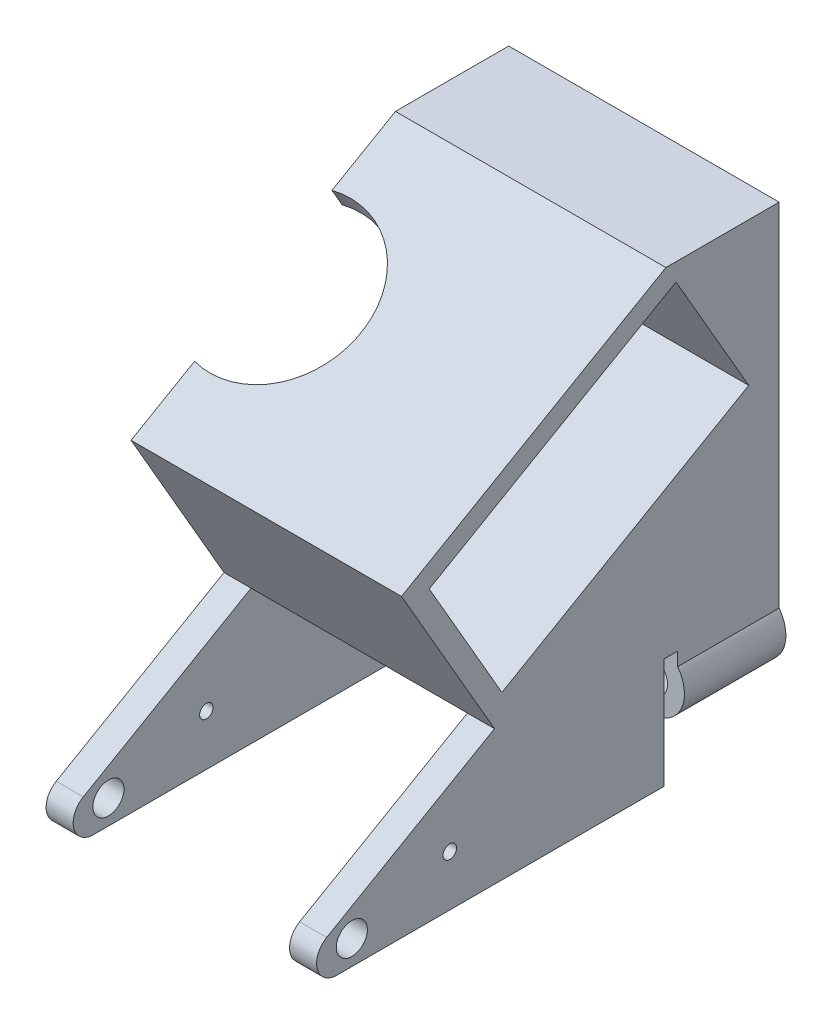
ISO-10303-21;
HEADER;
FILE_DESCRIPTION(('STEP AP214'),'2;1');
FILE_NAME('part.step','',(''),(''),'','','');
FILE_SCHEMA(('AUTOMOTIVE_DESIGN { 1 0 10303 214 1 1 1 1 }'));
ENDSEC;
DATA;
#1=APPLICATION_CONTEXT('core data for automotive mechanical design processes');
#2=APPLICATION_PROTOCOL_DEFINITION('international standard','automotive_design',2000,#1);
#3=PRODUCT_CONTEXT('',#1,'mechanical');
#4=PRODUCT('Part','Part','',(#3));
#5=PRODUCT_RELATED_PRODUCT_CATEGORY('part','',(#4));
#6=PRODUCT_DEFINITION_FORMATION('','',#4);
#7=PRODUCT_DEFINITION_CONTEXT('part definition',#1,'design');
#8=PRODUCT_DEFINITION('design','',#6,#7);
#9=PRODUCT_DEFINITION_SHAPE('','',#8);
#10=(LENGTH_UNIT() NAMED_UNIT(*) SI_UNIT(.MILLI.,.METRE.));
#11=(NAMED_UNIT(*) PLANE_ANGLE_UNIT() SI_UNIT($,.RADIAN.));
#12=(NAMED_UNIT(*) SI_UNIT($,.STERADIAN.) SOLID_ANGLE_UNIT());
#13=UNCERTAINTY_MEASURE_WITH_UNIT(LENGTH_MEASURE(1.E-05),#10,'distance_accuracy_value','');
#14=(GEOMETRIC_REPRESENTATION_CONTEXT(3) GLOBAL_UNCERTAINTY_ASSIGNED_CONTEXT((#13)) GLOBAL_UNIT_ASSIGNED_CONTEXT((#10,
#11,#12)) REPRESENTATION_CONTEXT('',''));
#15=CARTESIAN_POINT('',(0.,0.,0.));
#16=DIRECTION('',(0.,0.,1.));
#17=DIRECTION('',(1.,0.,0.));
#18=AXIS2_PLACEMENT_3D('',#15,#16,#17);
#19=CARTESIAN_POINT('',(-148.030771758971,44.953613053613,3.));
#20=DIRECTION('',(0.,0.,1.));
#21=DIRECTION('',(1.,0.,0.));
#22=AXIS2_PLACEMENT_3D('',#19,#20,#21);
#23=PLANE('',#22);
#24=DIRECTION('',(0.,-1.,0.));
#25=VECTOR('',#24,1.);
#26=CARTESIAN_POINT('',(-116.030771758971,99.9536130536131,3.));
#27=LINE('',#26,#25);
#28=CARTESIAN_POINT('',(-116.030771758971,76.137914449541,3.));
#29=VERTEX_POINT('',#28);
#30=CARTESIAN_POINT('',(-116.030771758971,49.953613053613,3.));
#31=VERTEX_POINT('',#30);
#32=EDGE_CURVE('E845',#29,#31,#27,.T.);
#33=ORIENTED_EDGE('',*,*,#32,.F.);
#34=DIRECTION('',(-1.,0.,0.));
#35=VECTOR('',#34,1.);
#36=CARTESIAN_POINT('',(-112.030771758971,76.137914449541,3.));
#37=LINE('',#36,#35);
#38=CARTESIAN_POINT('',(-148.030771758971,76.137914449541,3.));
#39=VERTEX_POINT('',#38);
#40=EDGE_CURVE('E259',#29,#39,#37,.T.);
#41=ORIENTED_EDGE('',*,*,#40,.T.);
#42=DIRECTION('',(0.,-1.,0.));
#43=VECTOR('',#42,1.);
#44=CARTESIAN_POINT('',(-148.030771758971,49.953613053613,3.));
#45=LINE('',#44,#43);
#46=CARTESIAN_POINT('',(-148.030771758971,49.953613053613,3.));
#47=VERTEX_POINT('',#46);
#48=EDGE_CURVE('E771',#39,#47,#45,.T.);
#49=ORIENTED_EDGE('',*,*,#48,.T.);
#50=CARTESIAN_POINT('',(-148.030771758971,44.953613053613,3.));
#51=DIRECTION('',(0.,0.,1.));
#52=DIRECTION('',(1.,0.,0.));
#53=AXIS2_PLACEMENT_3D('',#50,#51,#52);
#54=CIRCLE('',#53,4.99999999999999);
#55=CARTESIAN_POINT('',(-143.030771758971,44.953613053613,3.));
#56=VERTEX_POINT('',#55);
#57=EDGE_CURVE('E362',#56,#47,#54,.T.);
#58=ORIENTED_EDGE('',*,*,#57,.F.);
#59=DIRECTION('',(1.,0.,0.));
#60=VECTOR('',#59,1.);
#61=CARTESIAN_POINT('',(-143.030771758971,44.953613053613,3.));
#62=LINE('',#61,#60);
#63=CARTESIAN_POINT('',(-121.030771758971,44.953613053613,3.));
#64=VERTEX_POINT('',#63);
#65=EDGE_CURVE('E281',#56,#64,#62,.T.);
#66=ORIENTED_EDGE('',*,*,#65,.T.);
#67=CARTESIAN_POINT('',(-116.030771758971,44.953613053613,3.));
#68=DIRECTION('',(0.,0.,1.));
#69=DIRECTION('',(1.,0.,0.));
#70=AXIS2_PLACEMENT_3D('',#67,#68,#69);
#71=CIRCLE('',#70,5.);
#72=EDGE_CURVE('E349',#31,#64,#71,.T.);
#73=ORIENTED_EDGE('',*,*,#72,.F.);
#74=EDGE_LOOP('',(#33,#41,#49,#58,#66,#73));
#75=FACE_BOUND('',#74,.T.);
#76=ADVANCED_FACE('F33',(#75),#23,.T.);
#77=CARTESIAN_POINT('',(-148.030771758971,44.953613053613,0.));
#78=DIRECTION('',(0.,0.,1.));
#79=DIRECTION('',(1.,0.,0.));
#80=AXIS2_PLACEMENT_3D('',#77,#78,#79);
#81=PLANE('',#80);
#82=CARTESIAN_POINT('',(-148.030771758971,44.953613053613,0.));
#83=DIRECTION('',(0.,0.,1.));
#84=DIRECTION('',(1.,0.,0.));
#85=AXIS2_PLACEMENT_3D('',#82,#83,#84);
#86=CIRCLE('',#85,5.);
#87=CARTESIAN_POINT('',(-152.030771758971,47.953613053613,0.));
#88=VERTEX_POINT('',#87);
#89=CARTESIAN_POINT('',(-143.030771758971,44.953613053613,0.));
#90=VERTEX_POINT('',#89);
#91=EDGE_CURVE('E280',#88,#90,#86,.T.);
#92=ORIENTED_EDGE('',*,*,#91,.F.);
#93=DIRECTION('',(0.,-1.,0.));
#94=VECTOR('',#93,1.);
#95=CARTESIAN_POINT('',(-152.030771758971,47.953613053613,0.));
#96=LINE('',#95,#94);
#97=CARTESIAN_POINT('',(-152.030771758971,99.9536130536131,0.));
#98=VERTEX_POINT('',#97);
#99=EDGE_CURVE('E284',#98,#88,#96,.T.);
#100=ORIENTED_EDGE('',*,*,#99,.F.);
#101=DIRECTION('',(-1.,0.,0.));
#102=VECTOR('',#101,1.);
#103=CARTESIAN_POINT('',(-152.030771758971,99.9536130536131,0.));
#104=LINE('',#103,#102);
#105=CARTESIAN_POINT('',(-112.030771758971,99.9536130536131,0.));
#106=VERTEX_POINT('',#105);
#107=EDGE_CURVE('E293',#106,#98,#104,.T.);
#108=ORIENTED_EDGE('',*,*,#107,.F.);
#109=DIRECTION('',(0.,1.,0.));
#110=VECTOR('',#109,1.);
#111=CARTESIAN_POINT('',(-112.030771758971,99.9536130536131,0.));
#112=LINE('',#111,#110);
#113=CARTESIAN_POINT('',(-112.030771758971,47.953613053613,0.));
#114=VERTEX_POINT('',#113);
#115=EDGE_CURVE('E291',#114,#106,#112,.T.);
#116=ORIENTED_EDGE('',*,*,#115,.F.);
#117=CARTESIAN_POINT('',(-116.030771758971,44.953613053613,0.));
#118=DIRECTION('',(0.,0.,1.));
#119=DIRECTION('',(1.,0.,0.));
#120=AXIS2_PLACEMENT_3D('',#117,#118,#119);
#121=CIRCLE('',#120,5.);
#122=CARTESIAN_POINT('',(-121.030771758971,44.953613053613,0.));
#123=VERTEX_POINT('',#122);
#124=EDGE_CURVE('E289',#123,#114,#121,.T.);
#125=ORIENTED_EDGE('',*,*,#124,.F.);
#126=DIRECTION('',(1.,0.,0.));
#127=VECTOR('',#126,1.);
#128=CARTESIAN_POINT('',(-143.030771758971,44.953613053613,0.));
#129=LINE('',#128,#127);
#130=EDGE_CURVE('E287',#90,#123,#129,.T.);
#131=ORIENTED_EDGE('',*,*,#130,.F.);
#132=EDGE_LOOP('',(#92,#100,#108,#116,#125,#131));
#133=FACE_BOUND('',#132,.T.);
#134=CARTESIAN_POINT('',(-148.030771758971,44.953613053613,0.));
#135=DIRECTION('',(0.,0.,1.));
#136=DIRECTION('',(1.,0.,0.));
#137=AXIS2_PLACEMENT_3D('',#134,#135,#136);
#138=CIRCLE('',#137,2.5);
#139=CARTESIAN_POINT('',(-145.530771758971,44.953613053613,0.));
#140=VERTEX_POINT('',#139);
#141=EDGE_CURVE('E277',#140,#140,#138,.T.);
#142=ORIENTED_EDGE('',*,*,#141,.T.);
#143=EDGE_LOOP('',(#142));
#144=FACE_BOUND('',#143,.T.);
#145=CARTESIAN_POINT('',(-116.030771758971,44.953613053613,0.));
#146=DIRECTION('',(0.,0.,1.));
#147=DIRECTION('',(1.,0.,0.));
#148=AXIS2_PLACEMENT_3D('',#145,#146,#147);
#149=CIRCLE('',#148,2.5);
#150=CARTESIAN_POINT('',(-113.530771758971,44.953613053613,0.));
#151=VERTEX_POINT('',#150);
#152=EDGE_CURVE('E266',#151,#151,#149,.T.);
#153=ORIENTED_EDGE('',*,*,#152,.T.);
#154=EDGE_LOOP('',(#153));
#155=FACE_BOUND('',#154,.T.);
#156=ADVANCED_FACE('F321',(#133,#144,#155),#81,.F.);
#157=CARTESIAN_POINT('',(-148.030771758971,44.953613053613,3.));
#158=DIRECTION('',(0.,0.,-1.));
#159=DIRECTION('',(-1.,0.,0.));
#160=AXIS2_PLACEMENT_3D('',#157,#158,#159);
#161=CYLINDRICAL_SURFACE('',#160,5.);
#162=ORIENTED_EDGE('',*,*,#91,.T.);
#163=DIRECTION('',(0.,0.,-1.));
#164=VECTOR('',#163,1.);
#165=CARTESIAN_POINT('',(-143.030771758971,44.953613053613,3.));
#166=LINE('',#165,#164);
#167=EDGE_CURVE('E41',#56,#90,#166,.T.);
#168=ORIENTED_EDGE('',*,*,#167,.F.);
#169=ORIENTED_EDGE('',*,*,#57,.T.);
#170=DIRECTION('',(0.,0.,-1.));
#171=VECTOR('',#170,1.);
#172=CARTESIAN_POINT('',(-148.030771758971,49.953613053613,15.));
#173=LINE('',#172,#171);
#174=CARTESIAN_POINT('',(-148.030771758971,49.953613053613,15.));
#175=VERTEX_POINT('',#174);
#176=EDGE_CURVE('E372',#175,#47,#173,.T.);
#177=ORIENTED_EDGE('',*,*,#176,.F.);
#178=CARTESIAN_POINT('',(-148.030771758971,44.953613053613,15.));
#179=DIRECTION('',(0.,0.,1.));
#180=DIRECTION('',(1.,0.,0.));
#181=AXIS2_PLACEMENT_3D('',#178,#179,#180);
#182=CIRCLE('',#181,4.99999999999999);
#183=CARTESIAN_POINT('',(-152.030771758971,47.953613053613,15.));
#184=VERTEX_POINT('',#183);
#185=EDGE_CURVE('E363',#184,#175,#182,.T.);
#186=ORIENTED_EDGE('',*,*,#185,.F.);
#187=DIRECTION('',(0.,0.,-1.));
#188=VECTOR('',#187,1.);
#189=CARTESIAN_POINT('',(-152.030771758971,47.953613053613,3.));
#190=LINE('',#189,#188);
#191=EDGE_CURVE('E283',#184,#88,#190,.T.);
#192=ORIENTED_EDGE('',*,*,#191,.T.);
#193=EDGE_LOOP('',(#162,#168,#169,#177,#186,#192));
#194=FACE_BOUND('',#193,.T.);
#195=ADVANCED_FACE('F35',(#194),#161,.T.);
#196=CARTESIAN_POINT('',(-143.030771758971,44.953613053613,3.));
#197=DIRECTION('',(0.,1.,0.));
#198=DIRECTION('',(0.,0.,1.));
#199=AXIS2_PLACEMENT_3D('',#196,#197,#198);
#200=PLANE('',#199);
#201=ORIENTED_EDGE('',*,*,#130,.T.);
#202=DIRECTION('',(0.,0.,-1.));
#203=VECTOR('',#202,1.);
#204=CARTESIAN_POINT('',(-121.030771758971,44.953613053613,3.));
#205=LINE('',#204,#203);
#206=EDGE_CURVE('E307',#64,#123,#205,.T.);
#207=ORIENTED_EDGE('',*,*,#206,.F.);
#208=ORIENTED_EDGE('',*,*,#65,.F.);
#209=ORIENTED_EDGE('',*,*,#167,.T.);
#210=EDGE_LOOP('',(#201,#207,#208,#209));
#211=FACE_BOUND('',#210,.T.);
#212=ADVANCED_FACE('F313',(#211),#200,.F.);
#213=CARTESIAN_POINT('',(-116.030771758971,44.953613053613,3.));
#214=DIRECTION('',(0.,0.,-1.));
#215=DIRECTION('',(-1.,0.,0.));
#216=AXIS2_PLACEMENT_3D('',#213,#214,#215);
#217=CYLINDRICAL_SURFACE('',#216,5.);
#218=ORIENTED_EDGE('',*,*,#124,.T.);
#219=DIRECTION('',(0.,0.,-1.));
#220=VECTOR('',#219,1.);
#221=CARTESIAN_POINT('',(-112.030771758971,47.953613053613,3.));
#222=LINE('',#221,#220);
#223=CARTESIAN_POINT('',(-112.030771758971,47.953613053613,15.));
#224=VERTEX_POINT('',#223);
#225=EDGE_CURVE('E304',#224,#114,#222,.T.);
#226=ORIENTED_EDGE('',*,*,#225,.F.);
#227=CARTESIAN_POINT('',(-116.030771758971,44.953613053613,15.));
#228=DIRECTION('',(0.,0.,1.));
#229=DIRECTION('',(1.,0.,0.));
#230=AXIS2_PLACEMENT_3D('',#227,#228,#229);
#231=CIRCLE('',#230,5.);
#232=CARTESIAN_POINT('',(-116.030771758971,49.953613053613,15.));
#233=VERTEX_POINT('',#232);
#234=EDGE_CURVE('E343',#233,#224,#231,.T.);
#235=ORIENTED_EDGE('',*,*,#234,.F.);
#236=DIRECTION('',(0.,0.,-1.));
#237=VECTOR('',#236,1.);
#238=CARTESIAN_POINT('',(-116.030771758971,49.953613053613,15.));
#239=LINE('',#238,#237);
#240=EDGE_CURVE('E356',#233,#31,#239,.T.);
#241=ORIENTED_EDGE('',*,*,#240,.T.);
#242=ORIENTED_EDGE('',*,*,#72,.T.);
#243=ORIENTED_EDGE('',*,*,#206,.T.);
#244=EDGE_LOOP('',(#218,#226,#235,#241,#242,#243));
#245=FACE_BOUND('',#244,.T.);
#246=ADVANCED_FACE('F327',(#245),#217,.T.);
#247=CARTESIAN_POINT('',(-112.030771758971,99.9536130536131,3.));
#248=DIRECTION('',(-1.,0.,0.));
#249=DIRECTION('',(0.,0.,1.));
#250=AXIS2_PLACEMENT_3D('',#247,#248,#249);
#251=PLANE('',#250);
#252=DIRECTION('',(0.,0.866025403784439,0.5));
#253=VECTOR('',#252,1.);
#254=CARTESIAN_POINT('',(-112.030771758971,77.3786130536131,55.8510469808674));
#255=LINE('',#254,#253);
#256=CARTESIAN_POINT('',(-112.030771758971,53.562914449541,42.1010469808674));
#257=VERTEX_POINT('',#256);
#258=CARTESIAN_POINT('',(-112.030771758971,77.3786130536131,55.8510469808674));
#259=VERTEX_POINT('',#258);
#260=EDGE_CURVE('E253',#257,#259,#255,.T.);
#261=ORIENTED_EDGE('',*,*,#260,.F.);
#262=DIRECTION('',(0.,0.5,-0.866025403784439));
#263=VECTOR('',#262,1.);
#264=CARTESIAN_POINT('',(-112.030771758971,82.091839100559,-7.3125));
#265=LINE('',#264,#263);
#266=CARTESIAN_POINT('',(-112.030771758971,39.2359906608944,66.9160068989706));
#267=VERTEX_POINT('',#266);
#268=EDGE_CURVE('E839',#267,#257,#265,.T.);
#269=ORIENTED_EDGE('',*,*,#268,.F.);
#270=CARTESIAN_POINT('',(-112.030771758971,36.637914449541,65.4160068989707));
#271=DIRECTION('',(-1.,0.,0.));
#272=DIRECTION('',(0.,0.,1.));
#273=AXIS2_PLACEMENT_3D('',#270,#271,#272);
#274=CIRCLE('',#273,3.);
#275=CARTESIAN_POINT('',(-112.030771758971,33.637914449541,65.4160068989705));
#276=VERTEX_POINT('',#275);
#277=EDGE_CURVE('E864',#276,#267,#274,.T.);
#278=ORIENTED_EDGE('',*,*,#277,.F.);
#279=DIRECTION('',(0.,0.,1.));
#280=VECTOR('',#279,1.);
#281=CARTESIAN_POINT('',(-112.030771758971,33.637914449541,3.00000000000001));
#282=LINE('',#281,#280);
#283=CARTESIAN_POINT('',(-112.030771758971,33.637914449541,17.));
#284=VERTEX_POINT('',#283);
#285=EDGE_CURVE('E862',#284,#276,#282,.T.);
#286=ORIENTED_EDGE('',*,*,#285,.F.);
#287=DIRECTION('',(0.,-1.,0.));
#288=VECTOR('',#287,1.);
#289=CARTESIAN_POINT('',(-112.030771758971,99.9536130536131,17.));
#290=LINE('',#289,#288);
#291=CARTESIAN_POINT('',(-112.030771758971,49.953613053613,17.));
#292=VERTEX_POINT('',#291);
#293=EDGE_CURVE('E860',#292,#284,#290,.T.);
#294=ORIENTED_EDGE('',*,*,#293,.F.);
#295=DIRECTION('',(0.,0.,1.));
#296=VECTOR('',#295,1.);
#297=CARTESIAN_POINT('',(-112.030771758971,49.953613053613,3.));
#298=LINE('',#297,#296);
#299=CARTESIAN_POINT('',(-112.030771758971,49.953613053613,15.));
#300=VERTEX_POINT('',#299);
#301=EDGE_CURVE('E339',#300,#292,#298,.T.);
#302=ORIENTED_EDGE('',*,*,#301,.F.);
#303=DIRECTION('',(0.,1.,0.));
#304=VECTOR('',#303,1.);
#305=CARTESIAN_POINT('',(-112.030771758971,49.953613053613,15.));
#306=LINE('',#305,#304);
#307=EDGE_CURVE('E336',#224,#300,#306,.T.);
#308=ORIENTED_EDGE('',*,*,#307,.F.);
#309=ORIENTED_EDGE('',*,*,#225,.T.);
#310=ORIENTED_EDGE('',*,*,#115,.T.);
#311=DIRECTION('',(0.,0.,-1.));
#312=VECTOR('',#311,1.);
#313=CARTESIAN_POINT('',(-112.030771758971,99.9536130536131,3.));
#314=LINE('',#313,#312);
#315=CARTESIAN_POINT('',(-112.030771758971,99.9536130536131,16.75));
#316=VERTEX_POINT('',#315);
#317=EDGE_CURVE('E301',#316,#106,#314,.T.);
#318=ORIENTED_EDGE('',*,*,#317,.F.);
#319=DIRECTION('',(0.,0.5,-0.866025403784439));
#320=VECTOR('',#319,1.);
#321=CARTESIAN_POINT('',(-112.030771758971,99.9536130536131,16.75));
#322=LINE('',#321,#320);
#323=EDGE_CURVE('E256',#259,#316,#322,.T.);
#324=ORIENTED_EDGE('',*,*,#323,.F.);
#325=EDGE_LOOP('',(#261,#269,#278,#286,#294,#302,#308,#309,#310,#318,#324));
#326=FACE_BOUND('',#325,.T.);
#327=DIRECTION('',(0.,-0.866025403784439,-0.5));
#328=VECTOR('',#327,1.);
#329=CARTESIAN_POINT('',(-112.030771758971,97.3555368422598,15.25));
#330=LINE('',#329,#328);
#331=CARTESIAN_POINT('',(-112.030771758971,97.3555368422598,15.25));
#332=VERTEX_POINT('',#331);
#333=CARTESIAN_POINT('',(-112.030771758971,78.7359906608943,4.50000000000002));
#334=VERTEX_POINT('',#333);
#335=EDGE_CURVE('E252',#332,#334,#330,.T.);
#336=ORIENTED_EDGE('',*,*,#335,.T.);
#337=DIRECTION('',(0.,-0.5,0.866025403784439));
#338=VECTOR('',#337,1.);
#339=CARTESIAN_POINT('',(-112.030771758971,78.7359906608943,4.50000000000002));
#340=LINE('',#339,#338);
#341=CARTESIAN_POINT('',(-112.030771758971,57.6609906608943,41.0029707695141));
#342=VERTEX_POINT('',#341);
#343=EDGE_CURVE('E236',#334,#342,#340,.T.);
#344=ORIENTED_EDGE('',*,*,#343,.T.);
#345=DIRECTION('',(0.,0.866025403784439,0.5));
#346=VECTOR('',#345,1.);
#347=CARTESIAN_POINT('',(-112.030771758971,57.6609906608943,41.0029707695141));
#348=LINE('',#347,#346);
#349=CARTESIAN_POINT('',(-112.030771758971,76.2805368422598,51.7529707695141));
#350=VERTEX_POINT('',#349);
#351=EDGE_CURVE('E378',#342,#350,#348,.T.);
#352=ORIENTED_EDGE('',*,*,#351,.T.);
#353=DIRECTION('',(0.,0.500000000000001,-0.866025403784438));
#354=VECTOR('',#353,1.);
#355=CARTESIAN_POINT('',(-112.030771758971,76.2805368422597,51.7529707695141));
#356=LINE('',#355,#354);
#357=EDGE_CURVE('E381',#350,#332,#356,.T.);
#358=ORIENTED_EDGE('',*,*,#357,.T.);
#359=EDGE_LOOP('',(#336,#344,#352,#358));
#360=FACE_BOUND('',#359,.T.);
#361=CARTESIAN_POINT('',(-112.030771758971,37.2331982532768,63.1943774985059));
#362=DIRECTION('',(-1.,0.,0.));
#363=DIRECTION('',(0.,0.,1.));
#364=AXIS2_PLACEMENT_3D('',#361,#362,#363);
#365=CIRCLE('',#364,2.29999999999994);
#366=CARTESIAN_POINT('',(-112.030771758971,37.2331982532768,65.4943774985058));
#367=VERTEX_POINT('',#366);
#368=EDGE_CURVE('E833',#367,#367,#365,.T.);
#369=ORIENTED_EDGE('',*,*,#368,.T.);
#370=EDGE_LOOP('',(#369));
#371=FACE_BOUND('',#370,.T.);
#372=CARTESIAN_POINT('',(-112.030771758971,41.1154839298146,48.7054901041698));
#373=DIRECTION('',(-1.,0.,0.));
#374=DIRECTION('',(0.,0.,1.));
#375=AXIS2_PLACEMENT_3D('',#372,#373,#374);
#376=CIRCLE('',#375,0.999999999999998);
#377=CARTESIAN_POINT('',(-112.030771758971,41.1154839298146,49.7054901041698));
#378=VERTEX_POINT('',#377);
#379=EDGE_CURVE('E829',#378,#378,#376,.T.);
#380=ORIENTED_EDGE('',*,*,#379,.T.);
#381=EDGE_LOOP('',(#380));
#382=FACE_BOUND('',#381,.T.);
#383=ADVANCED_FACE('F333',(#326,#360,#371,#382),#251,.F.);
#384=CARTESIAN_POINT('',(-152.030771758971,99.9536130536131,3.));
#385=DIRECTION('',(0.,-1.,0.));
#386=DIRECTION('',(0.,0.,-1.));
#387=AXIS2_PLACEMENT_3D('',#384,#385,#386);
#388=PLANE('',#387);
#389=ORIENTED_EDGE('',*,*,#107,.T.);
#390=DIRECTION('',(0.,0.,-1.));
#391=VECTOR('',#390,1.);
#392=CARTESIAN_POINT('',(-152.030771758971,99.9536130536131,3.));
#393=LINE('',#392,#391);
#394=CARTESIAN_POINT('',(-152.030771758971,99.9536130536131,16.75));
#395=VERTEX_POINT('',#394);
#396=EDGE_CURVE('E298',#395,#98,#393,.T.);
#397=ORIENTED_EDGE('',*,*,#396,.F.);
#398=DIRECTION('',(-1.,0.,0.));
#399=VECTOR('',#398,1.);
#400=CARTESIAN_POINT('',(-112.030771758971,99.9536130536131,16.75));
#401=LINE('',#400,#399);
#402=EDGE_CURVE('E263',#316,#395,#401,.T.);
#403=ORIENTED_EDGE('',*,*,#402,.F.);
#404=ORIENTED_EDGE('',*,*,#317,.T.);
#405=EDGE_LOOP('',(#389,#397,#403,#404));
#406=FACE_BOUND('',#405,.T.);
#407=ADVANCED_FACE('F422',(#406),#388,.F.);
#408=CARTESIAN_POINT('',(-152.030771758971,47.953613053613,3.));
#409=DIRECTION('',(1.,0.,0.));
#410=DIRECTION('',(0.,0.,-1.));
#411=AXIS2_PLACEMENT_3D('',#408,#409,#410);
#412=PLANE('',#411);
#413=DIRECTION('',(0.,0.500000000000001,-0.866025403784438));
#414=VECTOR('',#413,1.);
#415=CARTESIAN_POINT('',(-152.030771758971,76.2805368422597,51.7529707695141));
#416=LINE('',#415,#414);
#417=CARTESIAN_POINT('',(-152.030771758971,91.9363841394125,24.6362478153057));
#418=VERTEX_POINT('',#417);
#419=CARTESIAN_POINT('',(-152.030771758971,97.3555368422598,15.25));
#420=VERTEX_POINT('',#419);
#421=EDGE_CURVE('E233',#418,#420,#416,.T.);
#422=ORIENTED_EDGE('',*,*,#421,.F.);
#423=DIRECTION('',(0.,0.866025403784439,0.5));
#424=VECTOR('',#423,1.);
#425=CARTESIAN_POINT('',(-152.030771758971,91.9363841394125,24.6362478153056));
#426=LINE('',#425,#424);
#427=CARTESIAN_POINT('',(-152.030771758971,94.5344603507658,26.1362478153057));
#428=VERTEX_POINT('',#427);
#429=EDGE_CURVE('E48',#418,#428,#426,.T.);
#430=ORIENTED_EDGE('',*,*,#429,.T.);
#431=DIRECTION('',(0.,0.5,-0.866025403784439));
#432=VECTOR('',#431,1.);
#433=CARTESIAN_POINT('',(-152.030771758971,99.9536130536131,16.75));
#434=LINE('',#433,#432);
#435=EDGE_CURVE('E261',#428,#395,#434,.T.);
#436=ORIENTED_EDGE('',*,*,#435,.T.);
#437=ORIENTED_EDGE('',*,*,#396,.T.);
#438=ORIENTED_EDGE('',*,*,#99,.T.);
#439=ORIENTED_EDGE('',*,*,#191,.F.);
#440=DIRECTION('',(0.,-1.,0.));
#441=VECTOR('',#440,1.);
#442=CARTESIAN_POINT('',(-152.030771758971,47.953613053613,15.));
#443=LINE('',#442,#441);
#444=CARTESIAN_POINT('',(-152.030771758971,49.953613053613,15.));
#445=VERTEX_POINT('',#444);
#446=EDGE_CURVE('E369',#445,#184,#443,.T.);
#447=ORIENTED_EDGE('',*,*,#446,.F.);
#448=DIRECTION('',(0.,0.,1.));
#449=VECTOR('',#448,1.);
#450=CARTESIAN_POINT('',(-152.030771758971,49.953613053613,17.));
#451=LINE('',#450,#449);
#452=CARTESIAN_POINT('',(-152.030771758971,49.953613053613,17.));
#453=VERTEX_POINT('',#452);
#454=EDGE_CURVE('E785',#445,#453,#451,.T.);
#455=ORIENTED_EDGE('',*,*,#454,.T.);
#456=DIRECTION('',(0.,-1.,0.));
#457=VECTOR('',#456,1.);
#458=CARTESIAN_POINT('',(-152.030771758971,33.637914449541,17.));
#459=LINE('',#458,#457);
#460=CARTESIAN_POINT('',(-152.030771758971,33.637914449541,17.));
#461=VERTEX_POINT('',#460);
#462=EDGE_CURVE('E787',#453,#461,#459,.T.);
#463=ORIENTED_EDGE('',*,*,#462,.T.);
#464=DIRECTION('',(0.,0.,1.));
#465=VECTOR('',#464,1.);
#466=CARTESIAN_POINT('',(-152.030771758971,33.637914449541,65.4160068989705));
#467=LINE('',#466,#465);
#468=CARTESIAN_POINT('',(-152.030771758971,33.637914449541,65.4160068989705));
#469=VERTEX_POINT('',#468);
#470=EDGE_CURVE('E791',#461,#469,#467,.T.);
#471=ORIENTED_EDGE('',*,*,#470,.T.);
#472=CARTESIAN_POINT('',(-152.030771758971,36.637914449541,65.4160068989707));
#473=DIRECTION('',(-1.,0.,0.));
#474=DIRECTION('',(0.,0.,-1.));
#475=AXIS2_PLACEMENT_3D('',#472,#473,#474);
#476=CIRCLE('',#475,3.);
#477=CARTESIAN_POINT('',(-152.030771758971,39.2359906608944,66.9160068989705));
#478=VERTEX_POINT('',#477);
#479=EDGE_CURVE('E794',#469,#478,#476,.T.);
#480=ORIENTED_EDGE('',*,*,#479,.T.);
#481=DIRECTION('',(0.,0.5,-0.866025403784439));
#482=VECTOR('',#481,1.);
#483=CARTESIAN_POINT('',(-152.030771758971,76.137914449541,3.));
#484=LINE('',#483,#482);
#485=CARTESIAN_POINT('',(-152.030771758971,53.562914449541,42.1010469808674));
#486=VERTEX_POINT('',#485);
#487=EDGE_CURVE('E797',#478,#486,#484,.T.);
#488=ORIENTED_EDGE('',*,*,#487,.T.);
#489=DIRECTION('',(0.,0.866025403784439,0.5));
#490=VECTOR('',#489,1.);
#491=CARTESIAN_POINT('',(-152.030771758971,77.3786130536131,55.8510469808674));
#492=LINE('',#491,#490);
#493=CARTESIAN_POINT('',(-152.030771758971,77.3786130536131,55.8510469808674));
#494=VERTEX_POINT('',#493);
#495=EDGE_CURVE('E244',#486,#494,#492,.T.);
#496=ORIENTED_EDGE('',*,*,#495,.T.);
#497=CARTESIAN_POINT('',(-152.030771758971,82.7977657564603,46.4647991655618));
#498=VERTEX_POINT('',#497);
#499=EDGE_CURVE('E225',#494,#498,#434,.T.);
#500=ORIENTED_EDGE('',*,*,#499,.T.);
#501=DIRECTION('',(0.,0.866025403784439,0.5));
#502=VECTOR('',#501,1.);
#503=CARTESIAN_POINT('',(-152.030771758971,80.199689545107,44.9647991655618));
#504=LINE('',#503,#502);
#505=CARTESIAN_POINT('',(-152.030771758971,80.199689545107,44.9647991655618));
#506=VERTEX_POINT('',#505);
#507=EDGE_CURVE('E211',#498,#506,#504,.F.);
#508=ORIENTED_EDGE('',*,*,#507,.T.);
#509=CARTESIAN_POINT('',(-152.030771758971,76.2805368422597,51.7529707695141));
#510=VERTEX_POINT('',#509);
#511=EDGE_CURVE('E222',#510,#506,#416,.T.);
#512=ORIENTED_EDGE('',*,*,#511,.F.);
#513=DIRECTION('',(0.,0.866025403784439,0.5));
#514=VECTOR('',#513,1.);
#515=CARTESIAN_POINT('',(-152.030771758971,57.6609906608943,41.0029707695141));
#516=LINE('',#515,#514);
#517=CARTESIAN_POINT('',(-152.030771758971,57.6609906608943,41.0029707695141));
#518=VERTEX_POINT('',#517);
#519=EDGE_CURVE('E238',#518,#510,#516,.T.);
#520=ORIENTED_EDGE('',*,*,#519,.F.);
#521=DIRECTION('',(0.,-0.5,0.866025403784439));
#522=VECTOR('',#521,1.);
#523=CARTESIAN_POINT('',(-152.030771758971,78.7359906608943,4.50000000000002));
#524=LINE('',#523,#522);
#525=CARTESIAN_POINT('',(-152.030771758971,78.7359906608943,4.50000000000002));
#526=VERTEX_POINT('',#525);
#527=EDGE_CURVE('E375',#526,#518,#524,.T.);
#528=ORIENTED_EDGE('',*,*,#527,.F.);
#529=DIRECTION('',(0.,-0.866025403784439,-0.5));
#530=VECTOR('',#529,1.);
#531=CARTESIAN_POINT('',(-152.030771758971,97.3555368422598,15.25));
#532=LINE('',#531,#530);
#533=EDGE_CURVE('E232',#420,#526,#532,.T.);
#534=ORIENTED_EDGE('',*,*,#533,.F.);
#535=EDGE_LOOP('',(#422,#430,#436,#437,#438,#439,#447,#455,#463,#471,#480,#488,#496,#500,#508,
#512,#520,#528,#534));
#536=FACE_BOUND('',#535,.T.);
#537=CARTESIAN_POINT('',(-152.030771758971,41.1154839298146,48.7054901041698));
#538=DIRECTION('',(-1.,0.,0.));
#539=DIRECTION('',(0.,0.,1.));
#540=AXIS2_PLACEMENT_3D('',#537,#538,#539);
#541=CIRCLE('',#540,0.999999999999998);
#542=CARTESIAN_POINT('',(-152.030771758971,41.1154839298146,49.7054901041698));
#543=VERTEX_POINT('',#542);
#544=EDGE_CURVE('E877',#543,#543,#541,.T.);
#545=ORIENTED_EDGE('',*,*,#544,.F.);
#546=EDGE_LOOP('',(#545));
#547=FACE_BOUND('',#546,.T.);
#548=CARTESIAN_POINT('',(-152.030771758971,37.2331982532768,63.1943774985059));
#549=DIRECTION('',(-1.,0.,0.));
#550=DIRECTION('',(0.,0.,1.));
#551=AXIS2_PLACEMENT_3D('',#548,#549,#550);
#552=CIRCLE('',#551,2.29999999999994);
#553=CARTESIAN_POINT('',(-152.030771758971,37.2331982532768,65.4943774985058));
#554=VERTEX_POINT('',#553);
#555=EDGE_CURVE('E881',#554,#554,#552,.T.);
#556=ORIENTED_EDGE('',*,*,#555,.F.);
#557=EDGE_LOOP('',(#556));
#558=FACE_BOUND('',#557,.T.);
#559=ADVANCED_FACE('F219',(#536,#547,#558),#412,.F.);
#560=CARTESIAN_POINT('',(-148.030771758971,44.953613053613,3.));
#561=DIRECTION('',(0.,0.,-1.));
#562=DIRECTION('',(-1.,0.,0.));
#563=AXIS2_PLACEMENT_3D('',#560,#561,#562);
#564=CYLINDRICAL_SURFACE('',#563,2.5);
#565=ORIENTED_EDGE('',*,*,#141,.F.);
#566=EDGE_LOOP('',(#565));
#567=FACE_BOUND('',#566,.T.);
#568=CARTESIAN_POINT('',(-148.030771758971,44.953613053613,15.));
#569=DIRECTION('',(0.,0.,1.));
#570=DIRECTION('',(1.,0.,0.));
#571=AXIS2_PLACEMENT_3D('',#568,#569,#570);
#572=CIRCLE('',#571,2.5);
#573=CARTESIAN_POINT('',(-145.530771758971,44.953613053613,15.));
#574=VERTEX_POINT('',#573);
#575=EDGE_CURVE('E359',#574,#574,#572,.T.);
#576=ORIENTED_EDGE('',*,*,#575,.T.);
#577=EDGE_LOOP('',(#576));
#578=FACE_BOUND('',#577,.T.);
#579=ADVANCED_FACE('F417',(#567,#578),#564,.F.);
#580=CARTESIAN_POINT('',(-116.030771758971,44.953613053613,3.));
#581=DIRECTION('',(0.,0.,-1.));
#582=DIRECTION('',(-1.,0.,0.));
#583=AXIS2_PLACEMENT_3D('',#580,#581,#582);
#584=CYLINDRICAL_SURFACE('',#583,2.5);
#585=ORIENTED_EDGE('',*,*,#152,.F.);
#586=EDGE_LOOP('',(#585));
#587=FACE_BOUND('',#586,.T.);
#588=CARTESIAN_POINT('',(-116.030771758971,44.953613053613,15.));
#589=DIRECTION('',(0.,0.,1.));
#590=DIRECTION('',(1.,0.,0.));
#591=AXIS2_PLACEMENT_3D('',#588,#589,#590);
#592=CIRCLE('',#591,2.5);
#593=CARTESIAN_POINT('',(-113.530771758971,44.953613053613,15.));
#594=VERTEX_POINT('',#593);
#595=EDGE_CURVE('E351',#594,#594,#592,.T.);
#596=ORIENTED_EDGE('',*,*,#595,.T.);
#597=EDGE_LOOP('',(#596));
#598=FACE_BOUND('',#597,.T.);
#599=ADVANCED_FACE('F487',(#587,#598),#584,.F.);
#600=CARTESIAN_POINT('',(-112.030771758971,99.9536130536131,16.75));
#601=DIRECTION('',(0.,0.866025403784439,0.5));
#602=DIRECTION('',(0.,-0.5,0.866025403784439));
#603=AXIS2_PLACEMENT_3D('',#600,#601,#602);
#604=PLANE('',#603);
#605=CARTESIAN_POINT('',(-149.530771758971,88.666113053613,36.3005234904337));
#606=DIRECTION('',(0.,0.866025403784439,0.5));
#607=DIRECTION('',(0.,-0.5,0.866025403784439));
#608=AXIS2_PLACEMENT_3D('',#605,#606,#607);
#609=CIRCLE('',#608,12.);
#610=EDGE_CURVE('E226',#498,#428,#609,.T.);
#611=ORIENTED_EDGE('',*,*,#610,.F.);
#612=ORIENTED_EDGE('',*,*,#499,.F.);
#613=DIRECTION('',(-1.,0.,0.));
#614=VECTOR('',#613,1.);
#615=CARTESIAN_POINT('',(-112.030771758971,77.3786130536131,55.8510469808674));
#616=LINE('',#615,#614);
#617=EDGE_CURVE('E267',#259,#494,#616,.T.);
#618=ORIENTED_EDGE('',*,*,#617,.F.);
#619=ORIENTED_EDGE('',*,*,#323,.T.);
#620=ORIENTED_EDGE('',*,*,#402,.T.);
#621=ORIENTED_EDGE('',*,*,#435,.F.);
#622=EDGE_LOOP('',(#611,#612,#618,#619,#620,#621));
#623=FACE_BOUND('',#622,.T.);
#624=ADVANCED_FACE('F497',(#623),#604,.T.);
#625=CARTESIAN_POINT('',(-112.030771758971,77.3786130536131,55.8510469808674));
#626=DIRECTION('',(0.,-0.5,0.866025403784439));
#627=DIRECTION('',(0.,-0.866025403784439,-0.5));
#628=AXIS2_PLACEMENT_3D('',#625,#626,#627);
#629=PLANE('',#628);
#630=ORIENTED_EDGE('',*,*,#495,.F.);
#631=DIRECTION('',(-1.,0.,0.));
#632=VECTOR('',#631,1.);
#633=CARTESIAN_POINT('',(-112.030771758971,53.562914449541,42.1010469808674));
#634=LINE('',#633,#632);
#635=CARTESIAN_POINT('',(-148.030771758971,53.562914449541,42.1010469808674));
#636=VERTEX_POINT('',#635);
#637=EDGE_CURVE('E273',#636,#486,#634,.T.);
#638=ORIENTED_EDGE('',*,*,#637,.F.);
#639=CARTESIAN_POINT('',(-116.030771758971,53.562914449541,42.1010469808674));
#640=VERTEX_POINT('',#639);
#641=EDGE_CURVE('E272',#640,#636,#634,.T.);
#642=ORIENTED_EDGE('',*,*,#641,.F.);
#643=EDGE_CURVE('E269',#257,#640,#634,.T.);
#644=ORIENTED_EDGE('',*,*,#643,.F.);
#645=ORIENTED_EDGE('',*,*,#260,.T.);
#646=ORIENTED_EDGE('',*,*,#617,.T.);
#647=EDGE_LOOP('',(#630,#638,#642,#644,#645,#646));
#648=FACE_BOUND('',#647,.T.);
#649=ADVANCED_FACE('F405',(#648),#629,.T.);
#650=CARTESIAN_POINT('',(-112.030771758971,76.137914449541,3.));
#651=DIRECTION('',(0.,-0.866025403784439,-0.5));
#652=DIRECTION('',(0.,0.5,-0.866025403784439));
#653=AXIS2_PLACEMENT_3D('',#650,#651,#652);
#654=PLANE('',#653);
#655=DIRECTION('',(0.,0.5,-0.866025403784439));
#656=VECTOR('',#655,1.);
#657=CARTESIAN_POINT('',(-116.030771758971,82.091839100559,-7.3125));
#658=LINE('',#657,#656);
#659=EDGE_CURVE('E55',#640,#29,#658,.T.);
#660=ORIENTED_EDGE('',*,*,#659,.F.);
#661=ORIENTED_EDGE('',*,*,#641,.T.);
#662=DIRECTION('',(0.,0.5,-0.866025403784439));
#663=VECTOR('',#662,1.);
#664=CARTESIAN_POINT('',(-148.030771758971,76.137914449541,3.));
#665=LINE('',#664,#663);
#666=EDGE_CURVE('E781',#636,#39,#665,.T.);
#667=ORIENTED_EDGE('',*,*,#666,.T.);
#668=ORIENTED_EDGE('',*,*,#40,.F.);
#669=EDGE_LOOP('',(#660,#661,#667,#668));
#670=FACE_BOUND('',#669,.T.);
#671=ADVANCED_FACE('F398',(#670),#654,.T.);
#672=CARTESIAN_POINT('',(-112.030771758971,78.7359906608943,4.50000000000002));
#673=DIRECTION('',(0.,-0.866025403784439,-0.5));
#674=DIRECTION('',(0.,0.5,-0.866025403784439));
#675=AXIS2_PLACEMENT_3D('',#672,#673,#674);
#676=PLANE('',#675);
#677=ORIENTED_EDGE('',*,*,#527,.T.);
#678=DIRECTION('',(-1.,0.,0.));
#679=VECTOR('',#678,1.);
#680=CARTESIAN_POINT('',(-112.030771758971,57.6609906608943,41.0029707695141));
#681=LINE('',#680,#679);
#682=EDGE_CURVE('E249',#342,#518,#681,.T.);
#683=ORIENTED_EDGE('',*,*,#682,.F.);
#684=ORIENTED_EDGE('',*,*,#343,.F.);
#685=DIRECTION('',(-1.,0.,0.));
#686=VECTOR('',#685,1.);
#687=CARTESIAN_POINT('',(-112.030771758971,78.7359906608943,4.50000000000002));
#688=LINE('',#687,#686);
#689=EDGE_CURVE('E242',#334,#526,#688,.T.);
#690=ORIENTED_EDGE('',*,*,#689,.T.);
#691=EDGE_LOOP('',(#677,#683,#684,#690));
#692=FACE_BOUND('',#691,.T.);
#693=ADVANCED_FACE('F396',(#692),#676,.F.);
#694=CARTESIAN_POINT('',(-112.030771758971,97.3555368422598,15.25));
#695=DIRECTION('',(0.,0.5,-0.866025403784439));
#696=DIRECTION('',(0.,0.866025403784439,0.5));
#697=AXIS2_PLACEMENT_3D('',#694,#695,#696);
#698=PLANE('',#697);
#699=ORIENTED_EDGE('',*,*,#533,.T.);
#700=ORIENTED_EDGE('',*,*,#689,.F.);
#701=ORIENTED_EDGE('',*,*,#335,.F.);
#702=DIRECTION('',(-1.,0.,0.));
#703=VECTOR('',#702,1.);
#704=CARTESIAN_POINT('',(-112.030771758971,97.3555368422598,15.25));
#705=LINE('',#704,#703);
#706=EDGE_CURVE('E245',#332,#420,#705,.T.);
#707=ORIENTED_EDGE('',*,*,#706,.T.);
#708=EDGE_LOOP('',(#699,#700,#701,#707));
#709=FACE_BOUND('',#708,.T.);
#710=ADVANCED_FACE('F392',(#709),#698,.F.);
#711=CARTESIAN_POINT('',(-112.030771758971,76.2805368422597,51.7529707695141));
#712=DIRECTION('',(0.,0.866025403784438,0.500000000000001));
#713=DIRECTION('',(0.,-0.500000000000001,0.866025403784438));
#714=AXIS2_PLACEMENT_3D('',#711,#712,#713);
#715=PLANE('',#714);
#716=ORIENTED_EDGE('',*,*,#511,.T.);
#717=CARTESIAN_POINT('',(-149.530771758971,86.0680368422598,34.8005234904337));
#718=DIRECTION('',(0.,0.866025403784438,0.500000000000001));
#719=DIRECTION('',(0.,-0.500000000000001,0.866025403784438));
#720=AXIS2_PLACEMENT_3D('',#717,#718,#719);
#721=CIRCLE('',#720,12.);
#722=EDGE_CURVE('E11',#506,#418,#721,.T.);
#723=ORIENTED_EDGE('',*,*,#722,.T.);
#724=ORIENTED_EDGE('',*,*,#421,.T.);
#725=ORIENTED_EDGE('',*,*,#706,.F.);
#726=ORIENTED_EDGE('',*,*,#357,.F.);
#727=DIRECTION('',(-1.,0.,0.));
#728=VECTOR('',#727,1.);
#729=CARTESIAN_POINT('',(-112.030771758971,76.2805368422597,51.7529707695141));
#730=LINE('',#729,#728);
#731=EDGE_CURVE('E230',#350,#510,#730,.T.);
#732=ORIENTED_EDGE('',*,*,#731,.T.);
#733=EDGE_LOOP('',(#716,#723,#724,#725,#726,#732));
#734=FACE_BOUND('',#733,.T.);
#735=ADVANCED_FACE('F228',(#734),#715,.F.);
#736=CARTESIAN_POINT('',(-112.030771758971,57.6609906608943,41.0029707695141));
#737=DIRECTION('',(0.,-0.5,0.866025403784439));
#738=DIRECTION('',(0.,-0.866025403784439,-0.5));
#739=AXIS2_PLACEMENT_3D('',#736,#737,#738);
#740=PLANE('',#739);
#741=ORIENTED_EDGE('',*,*,#519,.T.);
#742=ORIENTED_EDGE('',*,*,#731,.F.);
#743=ORIENTED_EDGE('',*,*,#351,.F.);
#744=ORIENTED_EDGE('',*,*,#682,.T.);
#745=EDGE_LOOP('',(#741,#742,#743,#744));
#746=FACE_BOUND('',#745,.T.);
#747=ADVANCED_FACE('F388',(#746),#740,.F.);
#748=CARTESIAN_POINT('',(-148.030771758971,44.953613053613,15.));
#749=DIRECTION('',(0.,0.,1.));
#750=DIRECTION('',(1.,0.,0.));
#751=AXIS2_PLACEMENT_3D('',#748,#749,#750);
#752=PLANE('',#751);
#753=ORIENTED_EDGE('',*,*,#185,.T.);
#754=DIRECTION('',(-1.,0.,0.));
#755=VECTOR('',#754,1.);
#756=CARTESIAN_POINT('',(-152.030771758971,49.953613053613,15.));
#757=LINE('',#756,#755);
#758=EDGE_CURVE('E366',#175,#445,#757,.T.);
#759=ORIENTED_EDGE('',*,*,#758,.T.);
#760=ORIENTED_EDGE('',*,*,#446,.T.);
#761=EDGE_LOOP('',(#753,#759,#760));
#762=FACE_BOUND('',#761,.T.);
#763=ORIENTED_EDGE('',*,*,#575,.F.);
#764=EDGE_LOOP('',(#763));
#765=FACE_BOUND('',#764,.T.);
#766=ADVANCED_FACE('F472',(#762,#765),#752,.T.);
#767=CARTESIAN_POINT('',(-116.030771758971,44.953613053613,15.));
#768=DIRECTION('',(0.,0.,1.));
#769=DIRECTION('',(1.,0.,0.));
#770=AXIS2_PLACEMENT_3D('',#767,#768,#769);
#771=PLANE('',#770);
#772=ORIENTED_EDGE('',*,*,#234,.T.);
#773=ORIENTED_EDGE('',*,*,#307,.T.);
#774=DIRECTION('',(-1.,0.,0.));
#775=VECTOR('',#774,1.);
#776=CARTESIAN_POINT('',(-112.030771758971,49.953613053613,15.));
#777=LINE('',#776,#775);
#778=EDGE_CURVE('E342',#300,#233,#777,.T.);
#779=ORIENTED_EDGE('',*,*,#778,.T.);
#780=EDGE_LOOP('',(#772,#773,#779));
#781=FACE_BOUND('',#780,.T.);
#782=ORIENTED_EDGE('',*,*,#595,.F.);
#783=EDGE_LOOP('',(#782));
#784=FACE_BOUND('',#783,.T.);
#785=ADVANCED_FACE('F345',(#781,#784),#771,.T.);
#786=CARTESIAN_POINT('',(-148.030771758971,49.953613053613,17.));
#787=DIRECTION('',(0.,-1.,0.));
#788=DIRECTION('',(0.,0.,-1.));
#789=AXIS2_PLACEMENT_3D('',#786,#787,#788);
#790=PLANE('',#789);
#791=ORIENTED_EDGE('',*,*,#454,.F.);
#792=ORIENTED_EDGE('',*,*,#758,.F.);
#793=DIRECTION('',(0.,0.,1.));
#794=VECTOR('',#793,1.);
#795=CARTESIAN_POINT('',(-148.030771758971,49.953613053613,17.));
#796=LINE('',#795,#794);
#797=CARTESIAN_POINT('',(-148.030771758971,49.953613053613,17.));
#798=VERTEX_POINT('',#797);
#799=EDGE_CURVE('E774',#175,#798,#796,.T.);
#800=ORIENTED_EDGE('',*,*,#799,.T.);
#801=DIRECTION('',(-1.,0.,0.));
#802=VECTOR('',#801,1.);
#803=CARTESIAN_POINT('',(-148.030771758971,49.953613053613,17.));
#804=LINE('',#803,#802);
#805=EDGE_CURVE('E775',#798,#453,#804,.T.);
#806=ORIENTED_EDGE('',*,*,#805,.T.);
#807=EDGE_LOOP('',(#791,#792,#800,#806));
#808=FACE_BOUND('',#807,.T.);
#809=ADVANCED_FACE('F530',(#808),#790,.T.);
#810=CARTESIAN_POINT('',(-148.030771758971,76.137914449541,3.));
#811=DIRECTION('',(0.,0.866025403784439,0.5));
#812=DIRECTION('',(0.,-0.5,0.866025403784439));
#813=AXIS2_PLACEMENT_3D('',#810,#811,#812);
#814=PLANE('',#813);
#815=CARTESIAN_POINT('',(-148.030771758971,39.2359906608944,66.9160068989705));
#816=VERTEX_POINT('',#815);
#817=EDGE_CURVE('E776',#816,#636,#665,.T.);
#818=ORIENTED_EDGE('',*,*,#817,.T.);
#819=ORIENTED_EDGE('',*,*,#637,.T.);
#820=ORIENTED_EDGE('',*,*,#487,.F.);
#821=DIRECTION('',(-1.,0.,0.));
#822=VECTOR('',#821,1.);
#823=CARTESIAN_POINT('',(-148.030771758971,39.2359906608944,66.9160068989705));
#824=LINE('',#823,#822);
#825=EDGE_CURVE('E800',#816,#478,#824,.T.);
#826=ORIENTED_EDGE('',*,*,#825,.F.);
#827=EDGE_LOOP('',(#818,#819,#820,#826));
#828=FACE_BOUND('',#827,.T.);
#829=ADVANCED_FACE('F633',(#828),#814,.T.);
#830=CARTESIAN_POINT('',(-148.030771758971,36.637914449541,65.4160068989707));
#831=DIRECTION('',(-1.,0.,0.));
#832=DIRECTION('',(0.,0.,1.));
#833=AXIS2_PLACEMENT_3D('',#830,#831,#832);
#834=CYLINDRICAL_SURFACE('',#833,3.);
#835=ORIENTED_EDGE('',*,*,#479,.F.);
#836=DIRECTION('',(-1.,0.,0.));
#837=VECTOR('',#836,1.);
#838=CARTESIAN_POINT('',(-148.030771758971,33.637914449541,65.4160068989705));
#839=LINE('',#838,#837);
#840=CARTESIAN_POINT('',(-148.030771758971,33.637914449541,65.4160068989705));
#841=VERTEX_POINT('',#840);
#842=EDGE_CURVE('E802',#841,#469,#839,.T.);
#843=ORIENTED_EDGE('',*,*,#842,.F.);
#844=CARTESIAN_POINT('',(-148.030771758971,36.637914449541,65.4160068989707));
#845=DIRECTION('',(-1.,0.,0.));
#846=DIRECTION('',(0.,0.,-1.));
#847=AXIS2_PLACEMENT_3D('',#844,#845,#846);
#848=CIRCLE('',#847,3.);
#849=EDGE_CURVE('E815',#841,#816,#848,.T.);
#850=ORIENTED_EDGE('',*,*,#849,.T.);
#851=ORIENTED_EDGE('',*,*,#825,.T.);
#852=EDGE_LOOP('',(#835,#843,#850,#851));
#853=FACE_BOUND('',#852,.T.);
#854=ADVANCED_FACE('F642',(#853),#834,.T.);
#855=CARTESIAN_POINT('',(-148.030771758971,33.637914449541,65.4160068989705));
#856=DIRECTION('',(0.,-1.,0.));
#857=DIRECTION('',(0.,0.,-1.));
#858=AXIS2_PLACEMENT_3D('',#855,#856,#857);
#859=PLANE('',#858);
#860=ORIENTED_EDGE('',*,*,#470,.F.);
#861=DIRECTION('',(-1.,0.,0.));
#862=VECTOR('',#861,1.);
#863=CARTESIAN_POINT('',(-148.030771758971,33.637914449541,17.));
#864=LINE('',#863,#862);
#865=CARTESIAN_POINT('',(-148.030771758971,33.637914449541,17.));
#866=VERTEX_POINT('',#865);
#867=EDGE_CURVE('E779',#866,#461,#864,.T.);
#868=ORIENTED_EDGE('',*,*,#867,.F.);
#869=DIRECTION('',(0.,0.,1.));
#870=VECTOR('',#869,1.);
#871=CARTESIAN_POINT('',(-148.030771758971,33.637914449541,65.4160068989705));
#872=LINE('',#871,#870);
#873=EDGE_CURVE('E813',#866,#841,#872,.T.);
#874=ORIENTED_EDGE('',*,*,#873,.T.);
#875=ORIENTED_EDGE('',*,*,#842,.T.);
#876=EDGE_LOOP('',(#860,#868,#874,#875));
#877=FACE_BOUND('',#876,.T.);
#878=ADVANCED_FACE('F651',(#877),#859,.T.);
#879=CARTESIAN_POINT('',(-148.030771758971,33.637914449541,17.));
#880=DIRECTION('',(0.,0.,-1.));
#881=DIRECTION('',(-1.,0.,0.));
#882=AXIS2_PLACEMENT_3D('',#879,#880,#881);
#883=PLANE('',#882);
#884=ORIENTED_EDGE('',*,*,#462,.F.);
#885=ORIENTED_EDGE('',*,*,#805,.F.);
#886=DIRECTION('',(0.,-1.,0.));
#887=VECTOR('',#886,1.);
#888=CARTESIAN_POINT('',(-148.030771758971,33.637914449541,17.));
#889=LINE('',#888,#887);
#890=EDGE_CURVE('E808',#798,#866,#889,.T.);
#891=ORIENTED_EDGE('',*,*,#890,.T.);
#892=ORIENTED_EDGE('',*,*,#867,.T.);
#893=EDGE_LOOP('',(#884,#885,#891,#892));
#894=FACE_BOUND('',#893,.T.);
#895=ADVANCED_FACE('F660',(#894),#883,.T.);
#896=CARTESIAN_POINT('',(-148.030771758971,36.637914449541,65.4160068989707));
#897=DIRECTION('',(1.,0.,0.));
#898=DIRECTION('',(0.,0.,-1.));
#899=AXIS2_PLACEMENT_3D('',#896,#897,#898);
#900=PLANE('',#899);
#901=CARTESIAN_POINT('',(-148.030771758971,41.1154839298146,48.7054901041698));
#902=DIRECTION('',(-1.,0.,0.));
#903=DIRECTION('',(0.,0.,1.));
#904=AXIS2_PLACEMENT_3D('',#901,#902,#903);
#905=CIRCLE('',#904,0.999999999999998);
#906=CARTESIAN_POINT('',(-148.030771758971,41.1154839298146,49.7054901041698));
#907=VERTEX_POINT('',#906);
#908=EDGE_CURVE('E878',#907,#907,#905,.T.);
#909=ORIENTED_EDGE('',*,*,#908,.T.);
#910=EDGE_LOOP('',(#909));
#911=FACE_BOUND('',#910,.T.);
#912=CARTESIAN_POINT('',(-148.030771758971,37.2331982532768,63.1943774985059));
#913=DIRECTION('',(-1.,0.,0.));
#914=DIRECTION('',(0.,0.,1.));
#915=AXIS2_PLACEMENT_3D('',#912,#913,#914);
#916=CIRCLE('',#915,2.29999999999994);
#917=CARTESIAN_POINT('',(-148.030771758971,37.2331982532768,65.4943774985058));
#918=VERTEX_POINT('',#917);
#919=EDGE_CURVE('E788',#918,#918,#916,.T.);
#920=ORIENTED_EDGE('',*,*,#919,.T.);
#921=EDGE_LOOP('',(#920));
#922=FACE_BOUND('',#921,.T.);
#923=ORIENTED_EDGE('',*,*,#176,.T.);
#924=ORIENTED_EDGE('',*,*,#48,.F.);
#925=ORIENTED_EDGE('',*,*,#666,.F.);
#926=ORIENTED_EDGE('',*,*,#817,.F.);
#927=ORIENTED_EDGE('',*,*,#849,.F.);
#928=ORIENTED_EDGE('',*,*,#873,.F.);
#929=ORIENTED_EDGE('',*,*,#890,.F.);
#930=ORIENTED_EDGE('',*,*,#799,.F.);
#931=EDGE_LOOP('',(#923,#924,#925,#926,#927,#928,#929,#930));
#932=FACE_BOUND('',#931,.T.);
#933=ADVANCED_FACE('F669',(#911,#922,#932),#900,.T.);
#934=CARTESIAN_POINT('',(-148.030771758971,37.2331982532768,63.1943774985059));
#935=DIRECTION('',(-1.,0.,0.));
#936=DIRECTION('',(0.,0.,1.));
#937=AXIS2_PLACEMENT_3D('',#934,#935,#936);
#938=CYLINDRICAL_SURFACE('',#937,2.29999999999994);
#939=ORIENTED_EDGE('',*,*,#919,.F.);
#940=EDGE_LOOP('',(#939));
#941=FACE_BOUND('',#940,.T.);
#942=ORIENTED_EDGE('',*,*,#555,.T.);
#943=EDGE_LOOP('',(#942));
#944=FACE_BOUND('',#943,.T.);
#945=ADVANCED_FACE('F678',(#941,#944),#938,.F.);
#946=CARTESIAN_POINT('',(-148.030771758971,41.1154839298146,48.7054901041698));
#947=DIRECTION('',(-1.,0.,0.));
#948=DIRECTION('',(0.,0.,1.));
#949=AXIS2_PLACEMENT_3D('',#946,#947,#948);
#950=CYLINDRICAL_SURFACE('',#949,0.999999999999998);
#951=ORIENTED_EDGE('',*,*,#908,.F.);
#952=EDGE_LOOP('',(#951));
#953=FACE_BOUND('',#952,.T.);
#954=ORIENTED_EDGE('',*,*,#544,.T.);
#955=EDGE_LOOP('',(#954));
#956=FACE_BOUND('',#955,.T.);
#957=ADVANCED_FACE('F543',(#953,#956),#950,.F.);
#958=CARTESIAN_POINT('',(-116.030771758971,36.637914449541,65.4160068989707));
#959=DIRECTION('',(-1.,0.,0.));
#960=DIRECTION('',(0.,0.,1.));
#961=AXIS2_PLACEMENT_3D('',#958,#959,#960);
#962=PLANE('',#961);
#963=CARTESIAN_POINT('',(-116.030771758971,37.2331982532768,63.1943774985059));
#964=DIRECTION('',(-1.,0.,0.));
#965=DIRECTION('',(0.,0.,1.));
#966=AXIS2_PLACEMENT_3D('',#963,#964,#965);
#967=CIRCLE('',#966,2.29999999999994);
#968=CARTESIAN_POINT('',(-116.030771758971,37.2331982532768,65.4943774985058));
#969=VERTEX_POINT('',#968);
#970=EDGE_CURVE('E836',#969,#969,#967,.T.);
#971=ORIENTED_EDGE('',*,*,#970,.F.);
#972=EDGE_LOOP('',(#971));
#973=FACE_BOUND('',#972,.T.);
#974=CARTESIAN_POINT('',(-116.030771758971,39.2359906608944,66.9160068989706));
#975=VERTEX_POINT('',#974);
#976=EDGE_CURVE('E842',#975,#640,#658,.T.);
#977=ORIENTED_EDGE('',*,*,#976,.T.);
#978=ORIENTED_EDGE('',*,*,#659,.T.);
#979=ORIENTED_EDGE('',*,*,#32,.T.);
#980=ORIENTED_EDGE('',*,*,#240,.F.);
#981=DIRECTION('',(0.,0.,1.));
#982=VECTOR('',#981,1.);
#983=CARTESIAN_POINT('',(-116.030771758971,49.953613053613,3.));
#984=LINE('',#983,#982);
#985=CARTESIAN_POINT('',(-116.030771758971,49.953613053613,17.));
#986=VERTEX_POINT('',#985);
#987=EDGE_CURVE('E848',#233,#986,#984,.T.);
#988=ORIENTED_EDGE('',*,*,#987,.T.);
#989=DIRECTION('',(0.,-1.,0.));
#990=VECTOR('',#989,1.);
#991=CARTESIAN_POINT('',(-116.030771758971,99.9536130536131,17.));
#992=LINE('',#991,#990);
#993=CARTESIAN_POINT('',(-116.030771758971,33.637914449541,17.));
#994=VERTEX_POINT('',#993);
#995=EDGE_CURVE('E850',#986,#994,#992,.T.);
#996=ORIENTED_EDGE('',*,*,#995,.T.);
#997=DIRECTION('',(0.,0.,1.));
#998=VECTOR('',#997,1.);
#999=CARTESIAN_POINT('',(-116.030771758971,33.637914449541,3.00000000000001));
#1000=LINE('',#999,#998);
#1001=CARTESIAN_POINT('',(-116.030771758971,33.637914449541,65.4160068989705));
#1002=VERTEX_POINT('',#1001);
#1003=EDGE_CURVE('E852',#994,#1002,#1000,.T.);
#1004=ORIENTED_EDGE('',*,*,#1003,.T.);
#1005=CARTESIAN_POINT('',(-116.030771758971,36.637914449541,65.4160068989707));
#1006=DIRECTION('',(-1.,0.,0.));
#1007=DIRECTION('',(0.,0.,1.));
#1008=AXIS2_PLACEMENT_3D('',#1005,#1006,#1007);
#1009=CIRCLE('',#1008,3.);
#1010=EDGE_CURVE('E854',#1002,#975,#1009,.T.);
#1011=ORIENTED_EDGE('',*,*,#1010,.T.);
#1012=EDGE_LOOP('',(#977,#978,#979,#980,#988,#996,#1004,#1011));
#1013=FACE_BOUND('',#1012,.T.);
#1014=CARTESIAN_POINT('',(-116.030771758971,41.1154839298146,48.7054901041698));
#1015=DIRECTION('',(-1.,0.,0.));
#1016=DIRECTION('',(0.,0.,1.));
#1017=AXIS2_PLACEMENT_3D('',#1014,#1015,#1016);
#1018=CIRCLE('',#1017,0.999999999999998);
#1019=CARTESIAN_POINT('',(-116.030771758971,41.1154839298146,49.7054901041698));
#1020=VERTEX_POINT('',#1019);
#1021=EDGE_CURVE('E830',#1020,#1020,#1018,.T.);
#1022=ORIENTED_EDGE('',*,*,#1021,.F.);
#1023=EDGE_LOOP('',(#1022));
#1024=FACE_BOUND('',#1023,.T.);
#1025=ADVANCED_FACE('F537',(#973,#1013,#1024),#962,.T.);
#1026=CARTESIAN_POINT('',(-116.030771758971,82.091839100559,-7.3125));
#1027=DIRECTION('',(0.,-0.866025403784439,-0.5));
#1028=DIRECTION('',(0.,0.5,-0.866025403784439));
#1029=AXIS2_PLACEMENT_3D('',#1026,#1027,#1028);
#1030=PLANE('',#1029);
#1031=ORIENTED_EDGE('',*,*,#643,.T.);
#1032=ORIENTED_EDGE('',*,*,#976,.F.);
#1033=DIRECTION('',(1.,0.,0.));
#1034=VECTOR('',#1033,1.);
#1035=CARTESIAN_POINT('',(-116.030771758971,39.2359906608944,66.9160068989706));
#1036=LINE('',#1035,#1034);
#1037=EDGE_CURVE('E856',#975,#267,#1036,.T.);
#1038=ORIENTED_EDGE('',*,*,#1037,.T.);
#1039=ORIENTED_EDGE('',*,*,#268,.T.);
#1040=EDGE_LOOP('',(#1031,#1032,#1038,#1039));
#1041=FACE_BOUND('',#1040,.T.);
#1042=ADVANCED_FACE('F542',(#1041),#1030,.F.);
#1043=CARTESIAN_POINT('',(-116.030771758971,49.953613053613,3.));
#1044=DIRECTION('',(0.,1.,0.));
#1045=DIRECTION('',(0.,0.,1.));
#1046=AXIS2_PLACEMENT_3D('',#1043,#1044,#1045);
#1047=PLANE('',#1046);
#1048=ORIENTED_EDGE('',*,*,#778,.F.);
#1049=ORIENTED_EDGE('',*,*,#301,.T.);
#1050=DIRECTION('',(1.,0.,0.));
#1051=VECTOR('',#1050,1.);
#1052=CARTESIAN_POINT('',(-116.030771758971,49.953613053613,17.));
#1053=LINE('',#1052,#1051);
#1054=EDGE_CURVE('E874',#986,#292,#1053,.T.);
#1055=ORIENTED_EDGE('',*,*,#1054,.F.);
#1056=ORIENTED_EDGE('',*,*,#987,.F.);
#1057=EDGE_LOOP('',(#1048,#1049,#1055,#1056));
#1058=FACE_BOUND('',#1057,.T.);
#1059=ADVANCED_FACE('F555',(#1058),#1047,.F.);
#1060=CARTESIAN_POINT('',(-116.030771758971,99.9536130536131,17.));
#1061=DIRECTION('',(0.,0.,1.));
#1062=DIRECTION('',(1.,0.,0.));
#1063=AXIS2_PLACEMENT_3D('',#1060,#1061,#1062);
#1064=PLANE('',#1063);
#1065=ORIENTED_EDGE('',*,*,#293,.T.);
#1066=DIRECTION('',(1.,0.,0.));
#1067=VECTOR('',#1066,1.);
#1068=CARTESIAN_POINT('',(-116.030771758971,33.637914449541,17.));
#1069=LINE('',#1068,#1067);
#1070=EDGE_CURVE('E871',#994,#284,#1069,.T.);
#1071=ORIENTED_EDGE('',*,*,#1070,.F.);
#1072=ORIENTED_EDGE('',*,*,#995,.F.);
#1073=ORIENTED_EDGE('',*,*,#1054,.T.);
#1074=EDGE_LOOP('',(#1065,#1071,#1072,#1073));
#1075=FACE_BOUND('',#1074,.T.);
#1076=ADVANCED_FACE('F565',(#1075),#1064,.F.);
#1077=CARTESIAN_POINT('',(-116.030771758971,33.637914449541,3.00000000000001));
#1078=DIRECTION('',(0.,1.,0.));
#1079=DIRECTION('',(0.,0.,1.));
#1080=AXIS2_PLACEMENT_3D('',#1077,#1078,#1079);
#1081=PLANE('',#1080);
#1082=ORIENTED_EDGE('',*,*,#285,.T.);
#1083=DIRECTION('',(1.,0.,0.));
#1084=VECTOR('',#1083,1.);
#1085=CARTESIAN_POINT('',(-116.030771758971,33.637914449541,65.4160068989705));
#1086=LINE('',#1085,#1084);
#1087=EDGE_CURVE('E868',#1002,#276,#1086,.T.);
#1088=ORIENTED_EDGE('',*,*,#1087,.F.);
#1089=ORIENTED_EDGE('',*,*,#1003,.F.);
#1090=ORIENTED_EDGE('',*,*,#1070,.T.);
#1091=EDGE_LOOP('',(#1082,#1088,#1089,#1090));
#1092=FACE_BOUND('',#1091,.T.);
#1093=ADVANCED_FACE('F575',(#1092),#1081,.F.);
#1094=CARTESIAN_POINT('',(-116.030771758971,36.637914449541,65.4160068989707));
#1095=DIRECTION('',(1.,0.,0.));
#1096=DIRECTION('',(0.,0.,-1.));
#1097=AXIS2_PLACEMENT_3D('',#1094,#1095,#1096);
#1098=CYLINDRICAL_SURFACE('',#1097,3.);
#1099=ORIENTED_EDGE('',*,*,#277,.T.);
#1100=ORIENTED_EDGE('',*,*,#1037,.F.);
#1101=ORIENTED_EDGE('',*,*,#1010,.F.);
#1102=ORIENTED_EDGE('',*,*,#1087,.T.);
#1103=EDGE_LOOP('',(#1099,#1100,#1101,#1102));
#1104=FACE_BOUND('',#1103,.T.);
#1105=ADVANCED_FACE('F585',(#1104),#1098,.T.);
#1106=CARTESIAN_POINT('',(-116.030771758971,37.2331982532768,63.1943774985059));
#1107=DIRECTION('',(1.,0.,0.));
#1108=DIRECTION('',(0.,0.,-1.));
#1109=AXIS2_PLACEMENT_3D('',#1106,#1107,#1108);
#1110=CYLINDRICAL_SURFACE('',#1109,2.29999999999994);
#1111=ORIENTED_EDGE('',*,*,#970,.T.);
#1112=EDGE_LOOP('',(#1111));
#1113=FACE_BOUND('',#1112,.T.);
#1114=ORIENTED_EDGE('',*,*,#368,.F.);
#1115=EDGE_LOOP('',(#1114));
#1116=FACE_BOUND('',#1115,.T.);
#1117=ADVANCED_FACE('F595',(#1113,#1116),#1110,.F.);
#1118=CARTESIAN_POINT('',(-116.030771758971,41.1154839298146,48.7054901041698));
#1119=DIRECTION('',(1.,0.,0.));
#1120=DIRECTION('',(0.,0.,-1.));
#1121=AXIS2_PLACEMENT_3D('',#1118,#1119,#1120);
#1122=CYLINDRICAL_SURFACE('',#1121,0.999999999999998);
#1123=ORIENTED_EDGE('',*,*,#1021,.T.);
#1124=EDGE_LOOP('',(#1123));
#1125=FACE_BOUND('',#1124,.T.);
#1126=ORIENTED_EDGE('',*,*,#379,.F.);
#1127=EDGE_LOOP('',(#1126));
#1128=FACE_BOUND('',#1127,.T.);
#1129=ADVANCED_FACE('F605',(#1125,#1128),#1122,.F.);
#1130=CARTESIAN_POINT('',(-149.530771758971,86.0680368422597,34.8005234904337));
#1131=DIRECTION('',(0.,0.866025403784439,0.5));
#1132=DIRECTION('',(0.,-0.5,0.866025403784439));
#1133=AXIS2_PLACEMENT_3D('',#1130,#1131,#1132);
#1134=CYLINDRICAL_SURFACE('',#1133,12.);
#1135=ORIENTED_EDGE('',*,*,#722,.F.);
#1136=ORIENTED_EDGE('',*,*,#507,.F.);
#1137=ORIENTED_EDGE('',*,*,#610,.T.);
#1138=ORIENTED_EDGE('',*,*,#429,.F.);
#1139=EDGE_LOOP('',(#1135,#1136,#1137,#1138));
#1140=FACE_BOUND('',#1139,.T.);
#1141=ADVANCED_FACE('F210',(#1140),#1134,.F.);
#1142=CLOSED_SHELL('',(#76,#156,#195,#212,#246,#383,#407,#559,#579,#599,#624,#649,#671,#693,
#710,#735,#747,#766,#785,#809,#829,#854,#878,#895,#933,#945,#957,#1025,#1042,#1059,#1076,#1093,
#1105,#1117,#1129,#1141));
#1143=MANIFOLD_SOLID_BREP('B2',#1142);
#1144=ADVANCED_BREP_SHAPE_REPRESENTATION('',(#18,#1143),#14);
#1145=SHAPE_DEFINITION_REPRESENTATION(#9,#1144);
ENDSEC;
END-ISO-10303-21;
